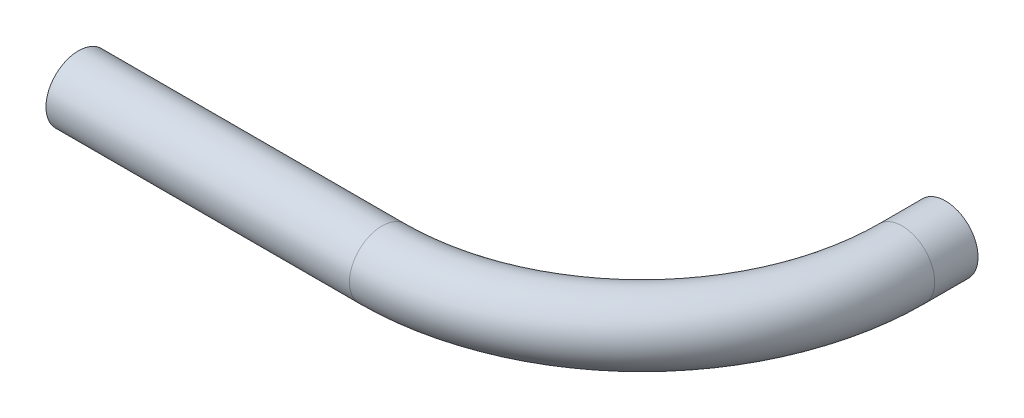
ISO-10303-21;
HEADER;
FILE_DESCRIPTION(('STEP AP214'),'2;1');
FILE_NAME('part.step','',(''),(''),'','','');
FILE_SCHEMA(('AUTOMOTIVE_DESIGN { 1 0 10303 214 1 1 1 1 }'));
ENDSEC;
DATA;
#1=APPLICATION_CONTEXT('core data for automotive mechanical design processes');
#2=APPLICATION_PROTOCOL_DEFINITION('international standard','automotive_design',2000,#1);
#3=PRODUCT_CONTEXT('',#1,'mechanical');
#4=PRODUCT('Part','Part','',(#3));
#5=PRODUCT_RELATED_PRODUCT_CATEGORY('part','',(#4));
#6=PRODUCT_DEFINITION_FORMATION('','',#4);
#7=PRODUCT_DEFINITION_CONTEXT('part definition',#1,'design');
#8=PRODUCT_DEFINITION('design','',#6,#7);
#9=PRODUCT_DEFINITION_SHAPE('','',#8);
#10=(LENGTH_UNIT() NAMED_UNIT(*) SI_UNIT(.MILLI.,.METRE.));
#11=(NAMED_UNIT(*) PLANE_ANGLE_UNIT() SI_UNIT($,.RADIAN.));
#12=(NAMED_UNIT(*) SI_UNIT($,.STERADIAN.) SOLID_ANGLE_UNIT());
#13=UNCERTAINTY_MEASURE_WITH_UNIT(LENGTH_MEASURE(1.E-05),#10,'distance_accuracy_value','');
#14=(GEOMETRIC_REPRESENTATION_CONTEXT(3) GLOBAL_UNCERTAINTY_ASSIGNED_CONTEXT((#13)) GLOBAL_UNIT_ASSIGNED_CONTEXT((#10,
#11,#12)) REPRESENTATION_CONTEXT('',''));
#15=CARTESIAN_POINT('',(0.,0.,0.));
#16=DIRECTION('',(0.,0.,1.));
#17=DIRECTION('',(1.,0.,0.));
#18=AXIS2_PLACEMENT_3D('',#15,#16,#17);
#19=CARTESIAN_POINT('',(0.,0.,0.));
#20=DIRECTION('',(1.,0.,0.));
#21=DIRECTION('',(0.,0.,-1.));
#22=AXIS2_PLACEMENT_3D('',#19,#20,#21);
#23=CYLINDRICAL_SURFACE('',#22,19.05);
#24=CARTESIAN_POINT('',(177.799999999999,0.,0.));
#25=DIRECTION('',(1.,0.,0.));
#26=DIRECTION('',(0.,0.,-1.));
#27=AXIS2_PLACEMENT_3D('',#24,#25,#26);
#28=CIRCLE('',#27,19.05);
#29=CARTESIAN_POINT('',(177.799999999999,0.,19.05));
#30=VERTEX_POINT('',#29);
#31=EDGE_CURVE('E89',#30,#30,#28,.T.);
#32=ORIENTED_EDGE('',*,*,#31,.F.);
#33=EDGE_LOOP('',(#32));
#34=FACE_BOUND('',#33,.T.);
#35=CARTESIAN_POINT('',(0.,0.,0.));
#36=DIRECTION('',(1.,0.,0.));
#37=DIRECTION('',(0.,0.,-1.));
#38=AXIS2_PLACEMENT_3D('',#35,#36,#37);
#39=CIRCLE('',#38,19.05);
#40=CARTESIAN_POINT('',(0.,0.,-19.05));
#41=VERTEX_POINT('',#40);
#42=EDGE_CURVE('E58',#41,#41,#39,.T.);
#43=ORIENTED_EDGE('',*,*,#42,.T.);
#44=EDGE_LOOP('',(#43));
#45=FACE_BOUND('',#44,.T.);
#46=ADVANCED_FACE('F43',(#34,#45),#23,.T.);
#47=CARTESIAN_POINT('',(177.8,0.,-152.4));
#48=DIRECTION('',(0.,1.,0.));
#49=DIRECTION('',(0.,0.,1.));
#50=AXIS2_PLACEMENT_3D('',#47,#48,#49);
#51=TOROIDAL_SURFACE('',#50,152.4,19.05);
#52=CARTESIAN_POINT('',(330.2,0.,-152.400000000001));
#53=DIRECTION('',(0.,0.,-1.));
#54=DIRECTION('',(-1.,0.,0.));
#55=AXIS2_PLACEMENT_3D('',#52,#53,#54);
#56=CIRCLE('',#55,19.05);
#57=CARTESIAN_POINT('',(349.25,0.,-152.400000000001));
#58=VERTEX_POINT('',#57);
#59=EDGE_CURVE('E47',#58,#58,#56,.T.);
#60=CARTESIAN_POINT('',(177.8,0.,-152.4));
#61=DIRECTION('',(0.,1.,0.));
#62=DIRECTION('',(0.,0.,1.));
#63=AXIS2_PLACEMENT_3D('',#60,#61,#62);
#64=CIRCLE('',#63,171.45);
#65=EDGE_CURVE('',#30,#58,#64,.T.);
#66=ORIENTED_EDGE('',*,*,#31,.T.);
#67=ORIENTED_EDGE('',*,*,#59,.F.);
#68=ORIENTED_EDGE('',*,*,#65,.T.);
#69=ORIENTED_EDGE('',*,*,#65,.F.);
#70=EDGE_LOOP('',(#66,#68,#67,#69));
#71=FACE_BOUND('',#70,.T.);
#72=ADVANCED_FACE('F97',(#71),#51,.T.);
#73=CARTESIAN_POINT('',(330.2,0.,-152.400000000001));
#74=DIRECTION('',(0.,0.,-1.));
#75=DIRECTION('',(-1.,0.,0.));
#76=AXIS2_PLACEMENT_3D('',#73,#74,#75);
#77=CYLINDRICAL_SURFACE('',#76,19.05);
#78=CARTESIAN_POINT('',(330.2,0.,-177.8));
#79=DIRECTION('',(0.,0.,-1.));
#80=DIRECTION('',(-1.,0.,0.));
#81=AXIS2_PLACEMENT_3D('',#78,#79,#80);
#82=CIRCLE('',#81,19.05);
#83=CARTESIAN_POINT('',(311.15,0.,-177.8));
#84=VERTEX_POINT('',#83);
#85=EDGE_CURVE('E63',#84,#84,#82,.T.);
#86=ORIENTED_EDGE('',*,*,#85,.F.);
#87=EDGE_LOOP('',(#86));
#88=FACE_BOUND('',#87,.T.);
#89=ORIENTED_EDGE('',*,*,#59,.T.);
#90=EDGE_LOOP('',(#89));
#91=FACE_BOUND('',#90,.T.);
#92=ADVANCED_FACE('F45',(#88,#91),#77,.T.);
#93=CARTESIAN_POINT('',(0.,0.,0.));
#94=DIRECTION('',(1.,0.,0.));
#95=DIRECTION('',(0.,0.,-1.));
#96=AXIS2_PLACEMENT_3D('',#93,#94,#95);
#97=PLANE('',#96);
#98=CARTESIAN_POINT('',(0.,0.,0.));
#99=DIRECTION('',(1.,0.,0.));
#100=DIRECTION('',(0.,0.,-1.));
#101=AXIS2_PLACEMENT_3D('',#98,#99,#100);
#102=CIRCLE('',#101,17.399);
#103=CARTESIAN_POINT('',(0.,0.,-17.399));
#104=VERTEX_POINT('',#103);
#105=EDGE_CURVE('E84',#104,#104,#102,.F.);
#106=ORIENTED_EDGE('',*,*,#105,.F.);
#107=EDGE_LOOP('',(#106));
#108=FACE_BOUND('',#107,.T.);
#109=ORIENTED_EDGE('',*,*,#42,.F.);
#110=EDGE_LOOP('',(#109));
#111=FACE_BOUND('',#110,.T.);
#112=ADVANCED_FACE('F103',(#108,#111),#97,.F.);
#113=CARTESIAN_POINT('',(330.2,0.,-177.8));
#114=DIRECTION('',(0.,0.,-1.));
#115=DIRECTION('',(-1.,0.,0.));
#116=AXIS2_PLACEMENT_3D('',#113,#114,#115);
#117=PLANE('',#116);
#118=CARTESIAN_POINT('',(330.2,0.,-177.8));
#119=DIRECTION('',(0.,0.,-1.));
#120=DIRECTION('',(-1.,0.,0.));
#121=AXIS2_PLACEMENT_3D('',#118,#119,#120);
#122=CIRCLE('',#121,17.399);
#123=CARTESIAN_POINT('',(312.801,0.,-177.8));
#124=VERTEX_POINT('',#123);
#125=EDGE_CURVE('E13',#124,#124,#122,.F.);
#126=ORIENTED_EDGE('',*,*,#125,.T.);
#127=EDGE_LOOP('',(#126));
#128=FACE_BOUND('',#127,.T.);
#129=ORIENTED_EDGE('',*,*,#85,.T.);
#130=EDGE_LOOP('',(#129));
#131=FACE_BOUND('',#130,.T.);
#132=ADVANCED_FACE('F70',(#128,#131),#117,.T.);
#133=CARTESIAN_POINT('',(0.,0.,0.));
#134=DIRECTION('',(1.,0.,0.));
#135=DIRECTION('',(0.,0.,-1.));
#136=AXIS2_PLACEMENT_3D('',#133,#134,#135);
#137=CYLINDRICAL_SURFACE('',#136,17.399);
#138=CARTESIAN_POINT('',(177.799999999999,0.,0.));
#139=DIRECTION('',(1.,0.,0.));
#140=DIRECTION('',(0.,0.,-1.));
#141=AXIS2_PLACEMENT_3D('',#138,#139,#140);
#142=CIRCLE('',#141,17.399);
#143=CARTESIAN_POINT('',(177.799999999999,0.,17.399));
#144=VERTEX_POINT('',#143);
#145=EDGE_CURVE('E81',#144,#144,#142,.F.);
#146=ORIENTED_EDGE('',*,*,#145,.F.);
#147=EDGE_LOOP('',(#146));
#148=FACE_BOUND('',#147,.T.);
#149=ORIENTED_EDGE('',*,*,#105,.T.);
#150=EDGE_LOOP('',(#149));
#151=FACE_BOUND('',#150,.T.);
#152=ADVANCED_FACE('F111',(#148,#151),#137,.F.);
#153=CARTESIAN_POINT('',(177.8,0.,-152.4));
#154=DIRECTION('',(0.,1.,0.));
#155=DIRECTION('',(0.,0.,1.));
#156=AXIS2_PLACEMENT_3D('',#153,#154,#155);
#157=TOROIDAL_SURFACE('',#156,152.4,17.399);
#158=CARTESIAN_POINT('',(330.2,0.,-152.400000000001));
#159=DIRECTION('',(0.,0.,-1.));
#160=DIRECTION('',(-1.,0.,0.));
#161=AXIS2_PLACEMENT_3D('',#158,#159,#160);
#162=CIRCLE('',#161,17.399);
#163=CARTESIAN_POINT('',(347.599,0.,-152.400000000001));
#164=VERTEX_POINT('',#163);
#165=EDGE_CURVE('E52',#164,#164,#162,.F.);
#166=CARTESIAN_POINT('',(177.8,0.,-152.4));
#167=DIRECTION('',(0.,1.,0.));
#168=DIRECTION('',(0.,0.,1.));
#169=AXIS2_PLACEMENT_3D('',#166,#167,#168);
#170=CIRCLE('',#169,169.799);
#171=EDGE_CURVE('',#144,#164,#170,.T.);
#172=ORIENTED_EDGE('',*,*,#145,.T.);
#173=ORIENTED_EDGE('',*,*,#165,.F.);
#174=ORIENTED_EDGE('',*,*,#171,.T.);
#175=ORIENTED_EDGE('',*,*,#171,.F.);
#176=EDGE_LOOP('',(#172,#174,#173,#175));
#177=FACE_BOUND('',#176,.T.);
#178=ADVANCED_FACE('F76',(#177),#157,.F.);
#179=CARTESIAN_POINT('',(330.2,0.,-152.400000000001));
#180=DIRECTION('',(0.,0.,-1.));
#181=DIRECTION('',(-1.,0.,0.));
#182=AXIS2_PLACEMENT_3D('',#179,#180,#181);
#183=CYLINDRICAL_SURFACE('',#182,17.399);
#184=ORIENTED_EDGE('',*,*,#125,.F.);
#185=EDGE_LOOP('',(#184));
#186=FACE_BOUND('',#185,.T.);
#187=ORIENTED_EDGE('',*,*,#165,.T.);
#188=EDGE_LOOP('',(#187));
#189=FACE_BOUND('',#188,.T.);
#190=ADVANCED_FACE('F73',(#186,#189),#183,.F.);
#191=CLOSED_SHELL('',(#46,#72,#92,#112,#132,#152,#178,#190));
#192=MANIFOLD_SOLID_BREP('B2',#191);
#193=ADVANCED_BREP_SHAPE_REPRESENTATION('',(#18,#192),#14);
#194=SHAPE_DEFINITION_REPRESENTATION(#9,#193);
ENDSEC;
END-ISO-10303-21;
